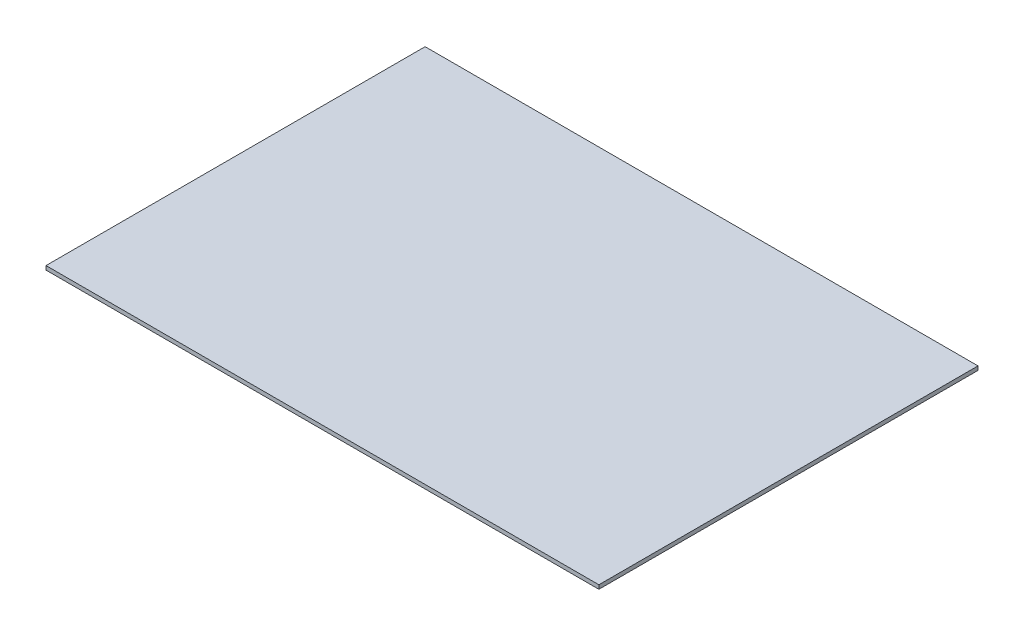
ISO-10303-21;
HEADER;
FILE_DESCRIPTION(('STEP AP214'),'2;1');
FILE_NAME('part.step','',(''),(''),'','','');
FILE_SCHEMA(('AUTOMOTIVE_DESIGN { 1 0 10303 214 1 1 1 1 }'));
ENDSEC;
DATA;
#1=APPLICATION_CONTEXT('core data for automotive mechanical design processes');
#2=APPLICATION_PROTOCOL_DEFINITION('international standard','automotive_design',2000,#1);
#3=PRODUCT_CONTEXT('',#1,'mechanical');
#4=PRODUCT('Part','Part','',(#3));
#5=PRODUCT_RELATED_PRODUCT_CATEGORY('part','',(#4));
#6=PRODUCT_DEFINITION_FORMATION('','',#4);
#7=PRODUCT_DEFINITION_CONTEXT('part definition',#1,'design');
#8=PRODUCT_DEFINITION('design','',#6,#7);
#9=PRODUCT_DEFINITION_SHAPE('','',#8);
#10=(LENGTH_UNIT() NAMED_UNIT(*) SI_UNIT(.MILLI.,.METRE.));
#11=(NAMED_UNIT(*) PLANE_ANGLE_UNIT() SI_UNIT($,.RADIAN.));
#12=(NAMED_UNIT(*) SI_UNIT($,.STERADIAN.) SOLID_ANGLE_UNIT());
#13=UNCERTAINTY_MEASURE_WITH_UNIT(LENGTH_MEASURE(1.E-05),#10,'distance_accuracy_value','');
#14=(GEOMETRIC_REPRESENTATION_CONTEXT(3) GLOBAL_UNCERTAINTY_ASSIGNED_CONTEXT((#13)) GLOBAL_UNIT_ASSIGNED_CONTEXT((#10,
#11,#12)) REPRESENTATION_CONTEXT('',''));
#15=CARTESIAN_POINT('',(0.,0.,0.));
#16=DIRECTION('',(0.,0.,1.));
#17=DIRECTION('',(1.,0.,0.));
#18=AXIS2_PLACEMENT_3D('',#15,#16,#17);
#19=CARTESIAN_POINT('',(444.5,6.35,304.8));
#20=DIRECTION('',(-1.,0.,0.));
#21=DIRECTION('',(0.,0.,1.));
#22=AXIS2_PLACEMENT_3D('',#19,#20,#21);
#23=PLANE('',#22);
#24=DIRECTION('',(0.,0.,-1.));
#25=VECTOR('',#24,1.);
#26=CARTESIAN_POINT('',(444.5,0.,304.8));
#27=LINE('',#26,#25);
#28=CARTESIAN_POINT('',(444.5,0.,304.8));
#29=VERTEX_POINT('',#28);
#30=CARTESIAN_POINT('',(444.5,0.,-304.8));
#31=VERTEX_POINT('',#30);
#32=EDGE_CURVE('E111',#29,#31,#27,.T.);
#33=ORIENTED_EDGE('',*,*,#32,.T.);
#34=DIRECTION('',(0.,-1.,0.));
#35=VECTOR('',#34,1.);
#36=CARTESIAN_POINT('',(444.5,6.35,-304.8));
#37=LINE('',#36,#35);
#38=CARTESIAN_POINT('',(444.5,6.35,-304.8));
#39=VERTEX_POINT('',#38);
#40=EDGE_CURVE('E11',#39,#31,#37,.T.);
#41=ORIENTED_EDGE('',*,*,#40,.F.);
#42=DIRECTION('',(0.,0.,-1.));
#43=VECTOR('',#42,1.);
#44=CARTESIAN_POINT('',(444.5,6.35,304.8));
#45=LINE('',#44,#43);
#46=CARTESIAN_POINT('',(444.5,6.35,304.8));
#47=VERTEX_POINT('',#46);
#48=EDGE_CURVE('E95',#47,#39,#45,.T.);
#49=ORIENTED_EDGE('',*,*,#48,.F.);
#50=DIRECTION('',(0.,-1.,0.));
#51=VECTOR('',#50,1.);
#52=CARTESIAN_POINT('',(444.5,6.35,304.8));
#53=LINE('',#52,#51);
#54=EDGE_CURVE('E107',#47,#29,#53,.T.);
#55=ORIENTED_EDGE('',*,*,#54,.T.);
#56=EDGE_LOOP('',(#33,#41,#49,#55));
#57=FACE_BOUND('',#56,.T.);
#58=ADVANCED_FACE('F43',(#57),#23,.F.);
#59=CARTESIAN_POINT('',(-444.5,6.35,-304.8));
#60=DIRECTION('',(0.,0.,1.));
#61=DIRECTION('',(1.,0.,0.));
#62=AXIS2_PLACEMENT_3D('',#59,#60,#61);
#63=PLANE('',#62);
#64=DIRECTION('',(-1.,0.,0.));
#65=VECTOR('',#64,1.);
#66=CARTESIAN_POINT('',(-444.5,0.,-304.8));
#67=LINE('',#66,#65);
#68=CARTESIAN_POINT('',(-444.5,0.,-304.8));
#69=VERTEX_POINT('',#68);
#70=EDGE_CURVE('E100',#31,#69,#67,.T.);
#71=ORIENTED_EDGE('',*,*,#70,.T.);
#72=DIRECTION('',(0.,-1.,0.));
#73=VECTOR('',#72,1.);
#74=CARTESIAN_POINT('',(-444.5,6.35,-304.8));
#75=LINE('',#74,#73);
#76=CARTESIAN_POINT('',(-444.5,6.35,-304.8));
#77=VERTEX_POINT('',#76);
#78=EDGE_CURVE('E52',#77,#69,#75,.T.);
#79=ORIENTED_EDGE('',*,*,#78,.F.);
#80=DIRECTION('',(-1.,0.,0.));
#81=VECTOR('',#80,1.);
#82=CARTESIAN_POINT('',(-444.5,6.35,-304.8));
#83=LINE('',#82,#81);
#84=EDGE_CURVE('E90',#39,#77,#83,.T.);
#85=ORIENTED_EDGE('',*,*,#84,.F.);
#86=ORIENTED_EDGE('',*,*,#40,.T.);
#87=EDGE_LOOP('',(#71,#79,#85,#86));
#88=FACE_BOUND('',#87,.T.);
#89=ADVANCED_FACE('F99',(#88),#63,.F.);
#90=CARTESIAN_POINT('',(-444.5,6.35,304.8));
#91=DIRECTION('',(1.,0.,0.));
#92=DIRECTION('',(0.,0.,-1.));
#93=AXIS2_PLACEMENT_3D('',#90,#91,#92);
#94=PLANE('',#93);
#95=DIRECTION('',(0.,0.,1.));
#96=VECTOR('',#95,1.);
#97=CARTESIAN_POINT('',(-444.5,0.,304.8));
#98=LINE('',#97,#96);
#99=CARTESIAN_POINT('',(-444.5,0.,304.8));
#100=VERTEX_POINT('',#99);
#101=EDGE_CURVE('E77',#69,#100,#98,.T.);
#102=ORIENTED_EDGE('',*,*,#101,.T.);
#103=DIRECTION('',(0.,-1.,0.));
#104=VECTOR('',#103,1.);
#105=CARTESIAN_POINT('',(-444.5,6.35,304.8));
#106=LINE('',#105,#104);
#107=CARTESIAN_POINT('',(-444.5,6.35,304.8));
#108=VERTEX_POINT('',#107);
#109=EDGE_CURVE('E102',#108,#100,#106,.T.);
#110=ORIENTED_EDGE('',*,*,#109,.F.);
#111=DIRECTION('',(0.,0.,1.));
#112=VECTOR('',#111,1.);
#113=CARTESIAN_POINT('',(-444.5,6.35,304.8));
#114=LINE('',#113,#112);
#115=EDGE_CURVE('E93',#77,#108,#114,.T.);
#116=ORIENTED_EDGE('',*,*,#115,.F.);
#117=ORIENTED_EDGE('',*,*,#78,.T.);
#118=EDGE_LOOP('',(#102,#110,#116,#117));
#119=FACE_BOUND('',#118,.T.);
#120=ADVANCED_FACE('F103',(#119),#94,.F.);
#121=CARTESIAN_POINT('',(-444.5,6.35,304.8));
#122=DIRECTION('',(0.,0.,-1.));
#123=DIRECTION('',(-1.,0.,0.));
#124=AXIS2_PLACEMENT_3D('',#121,#122,#123);
#125=PLANE('',#124);
#126=DIRECTION('',(1.,0.,0.));
#127=VECTOR('',#126,1.);
#128=CARTESIAN_POINT('',(-444.5,0.,304.8));
#129=LINE('',#128,#127);
#130=EDGE_CURVE('E83',#100,#29,#129,.T.);
#131=ORIENTED_EDGE('',*,*,#130,.T.);
#132=ORIENTED_EDGE('',*,*,#54,.F.);
#133=DIRECTION('',(1.,0.,0.));
#134=VECTOR('',#133,1.);
#135=CARTESIAN_POINT('',(-444.5,6.35,304.8));
#136=LINE('',#135,#134);
#137=EDGE_CURVE('E60',#108,#47,#136,.T.);
#138=ORIENTED_EDGE('',*,*,#137,.F.);
#139=ORIENTED_EDGE('',*,*,#109,.T.);
#140=EDGE_LOOP('',(#131,#132,#138,#139));
#141=FACE_BOUND('',#140,.T.);
#142=ADVANCED_FACE('F124',(#141),#125,.F.);
#143=CARTESIAN_POINT('',(0.,6.35,0.));
#144=DIRECTION('',(0.,-1.,0.));
#145=DIRECTION('',(0.,0.,-1.));
#146=AXIS2_PLACEMENT_3D('',#143,#144,#145);
#147=PLANE('',#146);
#148=ORIENTED_EDGE('',*,*,#48,.T.);
#149=ORIENTED_EDGE('',*,*,#84,.T.);
#150=ORIENTED_EDGE('',*,*,#115,.T.);
#151=ORIENTED_EDGE('',*,*,#137,.T.);
#152=EDGE_LOOP('',(#148,#149,#150,#151));
#153=FACE_BOUND('',#152,.T.);
#154=ADVANCED_FACE('F91',(#153),#147,.F.);
#155=CARTESIAN_POINT('',(0.,0.,0.));
#156=DIRECTION('',(0.,-1.,0.));
#157=DIRECTION('',(0.,0.,-1.));
#158=AXIS2_PLACEMENT_3D('',#155,#156,#157);
#159=PLANE('',#158);
#160=ORIENTED_EDGE('',*,*,#32,.F.);
#161=ORIENTED_EDGE('',*,*,#130,.F.);
#162=ORIENTED_EDGE('',*,*,#101,.F.);
#163=ORIENTED_EDGE('',*,*,#70,.F.);
#164=EDGE_LOOP('',(#160,#161,#162,#163));
#165=FACE_BOUND('',#164,.T.);
#166=ADVANCED_FACE('F127',(#165),#159,.T.);
#167=CLOSED_SHELL('',(#58,#89,#120,#142,#154,#166));
#168=MANIFOLD_SOLID_BREP('B2',#167);
#169=ADVANCED_BREP_SHAPE_REPRESENTATION('',(#18,#168),#14);
#170=SHAPE_DEFINITION_REPRESENTATION(#9,#169);
ENDSEC;
END-ISO-10303-21;
